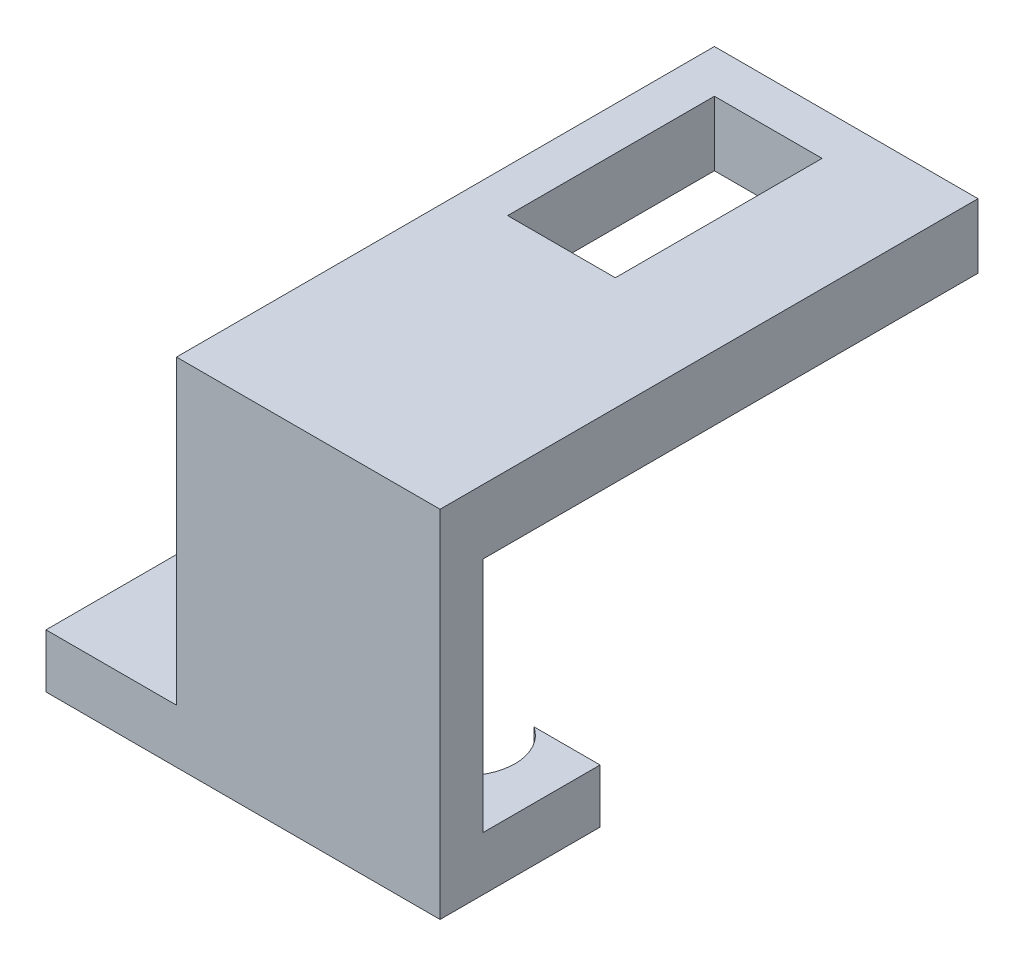
ISO-10303-21;
HEADER;
FILE_DESCRIPTION(('STEP AP214'),'2;1');
FILE_NAME('part.step','',(''),(''),'','','');
FILE_SCHEMA(('AUTOMOTIVE_DESIGN { 1 0 10303 214 1 1 1 1 }'));
ENDSEC;
DATA;
#1=APPLICATION_CONTEXT('core data for automotive mechanical design processes');
#2=APPLICATION_PROTOCOL_DEFINITION('international standard','automotive_design',2000,#1);
#3=PRODUCT_CONTEXT('',#1,'mechanical');
#4=PRODUCT('Part','Part','',(#3));
#5=PRODUCT_RELATED_PRODUCT_CATEGORY('part','',(#4));
#6=PRODUCT_DEFINITION_FORMATION('','',#4);
#7=PRODUCT_DEFINITION_CONTEXT('part definition',#1,'design');
#8=PRODUCT_DEFINITION('design','',#6,#7);
#9=PRODUCT_DEFINITION_SHAPE('','',#8);
#10=(LENGTH_UNIT() NAMED_UNIT(*) SI_UNIT(.MILLI.,.METRE.));
#11=(NAMED_UNIT(*) PLANE_ANGLE_UNIT() SI_UNIT($,.RADIAN.));
#12=(NAMED_UNIT(*) SI_UNIT($,.STERADIAN.) SOLID_ANGLE_UNIT());
#13=UNCERTAINTY_MEASURE_WITH_UNIT(LENGTH_MEASURE(1.E-05),#10,'distance_accuracy_value','');
#14=(GEOMETRIC_REPRESENTATION_CONTEXT(3) GLOBAL_UNCERTAINTY_ASSIGNED_CONTEXT((#13)) GLOBAL_UNIT_ASSIGNED_CONTEXT((#10,
#11,#12)) REPRESENTATION_CONTEXT('',''));
#15=CARTESIAN_POINT('',(0.,0.,0.));
#16=DIRECTION('',(0.,0.,1.));
#17=DIRECTION('',(1.,0.,0.));
#18=AXIS2_PLACEMENT_3D('',#15,#16,#17);
#19=CARTESIAN_POINT('',(9.15,16.5,3.5));
#20=DIRECTION('',(0.,0.,1.));
#21=DIRECTION('',(1.,0.,0.));
#22=AXIS2_PLACEMENT_3D('',#19,#20,#21);
#23=PLANE('',#22);
#24=DIRECTION('',(-1.,0.,0.));
#25=VECTOR('',#24,1.);
#26=CARTESIAN_POINT('',(9.15,2.5,3.5));
#27=LINE('',#26,#25);
#28=CARTESIAN_POINT('',(9.15,2.5,3.5));
#29=VERTEX_POINT('',#28);
#30=CARTESIAN_POINT('',(-3.09,2.5,3.5));
#31=VERTEX_POINT('',#30);
#32=EDGE_CURVE('E309',#29,#31,#27,.T.);
#33=ORIENTED_EDGE('',*,*,#32,.T.);
#34=DIRECTION('',(0.,-1.,0.));
#35=VECTOR('',#34,1.);
#36=CARTESIAN_POINT('',(-3.09,2.5,3.5));
#37=LINE('',#36,#35);
#38=CARTESIAN_POINT('',(-3.09,13.5,3.5));
#39=VERTEX_POINT('',#38);
#40=EDGE_CURVE('E389',#39,#31,#37,.T.);
#41=ORIENTED_EDGE('',*,*,#40,.F.);
#42=DIRECTION('',(-1.,0.,0.));
#43=VECTOR('',#42,1.);
#44=CARTESIAN_POINT('',(-9.15,13.5,3.5));
#45=LINE('',#44,#43);
#46=CARTESIAN_POINT('',(9.15,13.5,3.5));
#47=VERTEX_POINT('',#46);
#48=EDGE_CURVE('E392',#47,#39,#45,.T.);
#49=ORIENTED_EDGE('',*,*,#48,.F.);
#50=DIRECTION('',(0.,-1.,0.));
#51=VECTOR('',#50,1.);
#52=CARTESIAN_POINT('',(9.15,16.5,3.5));
#53=LINE('',#52,#51);
#54=EDGE_CURVE('E224',#47,#29,#53,.T.);
#55=ORIENTED_EDGE('',*,*,#54,.T.);
#56=EDGE_LOOP('',(#33,#41,#49,#55));
#57=FACE_BOUND('',#56,.T.);
#58=ADVANCED_FACE('F39',(#57),#23,.F.);
#59=CARTESIAN_POINT('',(-9.15,2.5,5.5));
#60=DIRECTION('',(0.,0.,-1.));
#61=DIRECTION('',(-1.,0.,0.));
#62=AXIS2_PLACEMENT_3D('',#59,#60,#61);
#63=PLANE('',#62);
#64=DIRECTION('',(1.,0.,0.));
#65=VECTOR('',#64,1.);
#66=CARTESIAN_POINT('',(9.15,16.5,5.5));
#67=LINE('',#66,#65);
#68=CARTESIAN_POINT('',(-3.09,16.5,5.5));
#69=VERTEX_POINT('',#68);
#70=CARTESIAN_POINT('',(9.15,16.5,5.5));
#71=VERTEX_POINT('',#70);
#72=EDGE_CURVE('E230',#69,#71,#67,.T.);
#73=ORIENTED_EDGE('',*,*,#72,.F.);
#74=DIRECTION('',(0.,1.,0.));
#75=VECTOR('',#74,1.);
#76=CARTESIAN_POINT('',(-3.09,2.5,5.5));
#77=LINE('',#76,#75);
#78=CARTESIAN_POINT('',(-3.09,2.5,5.5));
#79=VERTEX_POINT('',#78);
#80=EDGE_CURVE('E205',#79,#69,#77,.T.);
#81=ORIENTED_EDGE('',*,*,#80,.F.);
#82=DIRECTION('',(1.,0.,0.));
#83=VECTOR('',#82,1.);
#84=CARTESIAN_POINT('',(-9.15,2.5,5.5));
#85=LINE('',#84,#83);
#86=CARTESIAN_POINT('',(-9.15,2.5,5.5));
#87=VERTEX_POINT('',#86);
#88=EDGE_CURVE('E188',#87,#79,#85,.T.);
#89=ORIENTED_EDGE('',*,*,#88,.F.);
#90=DIRECTION('',(0.,-1.,0.));
#91=VECTOR('',#90,1.);
#92=CARTESIAN_POINT('',(-9.15,2.5,5.5));
#93=LINE('',#92,#91);
#94=CARTESIAN_POINT('',(-9.15,0.,5.5));
#95=VERTEX_POINT('',#94);
#96=EDGE_CURVE('E11',#87,#95,#93,.T.);
#97=ORIENTED_EDGE('',*,*,#96,.T.);
#98=DIRECTION('',(1.,0.,0.));
#99=VECTOR('',#98,1.);
#100=CARTESIAN_POINT('',(-9.15,0.,5.5));
#101=LINE('',#100,#99);
#102=CARTESIAN_POINT('',(9.15,0.,5.5));
#103=VERTEX_POINT('',#102);
#104=EDGE_CURVE('E217',#95,#103,#101,.T.);
#105=ORIENTED_EDGE('',*,*,#104,.T.);
#106=DIRECTION('',(0.,-1.,0.));
#107=VECTOR('',#106,1.);
#108=CARTESIAN_POINT('',(9.15,2.5,5.5));
#109=LINE('',#108,#107);
#110=EDGE_CURVE('E48',#71,#103,#109,.T.);
#111=ORIENTED_EDGE('',*,*,#110,.F.);
#112=EDGE_LOOP('',(#73,#81,#89,#97,#105,#111));
#113=FACE_BOUND('',#112,.T.);
#114=ADVANCED_FACE('F41',(#113),#63,.F.);
#115=CARTESIAN_POINT('',(9.15,2.5,3.5));
#116=DIRECTION('',(-1.,0.,0.));
#117=DIRECTION('',(0.,0.,1.));
#118=AXIS2_PLACEMENT_3D('',#115,#116,#117);
#119=PLANE('',#118);
#120=DIRECTION('',(0.,0.,-1.));
#121=VECTOR('',#120,1.);
#122=CARTESIAN_POINT('',(9.15,0.,3.5));
#123=LINE('',#122,#121);
#124=CARTESIAN_POINT('',(9.15,0.,-1.93067345763078));
#125=VERTEX_POINT('',#124);
#126=EDGE_CURVE('E220',#103,#125,#123,.T.);
#127=ORIENTED_EDGE('',*,*,#126,.T.);
#128=DIRECTION('',(0.,-1.,0.));
#129=VECTOR('',#128,1.);
#130=CARTESIAN_POINT('',(9.15,2.5,-1.93067345763078));
#131=LINE('',#130,#129);
#132=CARTESIAN_POINT('',(9.15,2.5,-1.93067345763078));
#133=VERTEX_POINT('',#132);
#134=EDGE_CURVE('E294',#133,#125,#131,.T.);
#135=ORIENTED_EDGE('',*,*,#134,.F.);
#136=DIRECTION('',(0.,0.,-1.));
#137=VECTOR('',#136,1.);
#138=CARTESIAN_POINT('',(9.15,2.5,5.5));
#139=LINE('',#138,#137);
#140=EDGE_CURVE('E197',#29,#133,#139,.T.);
#141=ORIENTED_EDGE('',*,*,#140,.F.);
#142=ORIENTED_EDGE('',*,*,#54,.F.);
#143=DIRECTION('',(0.,0.,1.));
#144=VECTOR('',#143,1.);
#145=CARTESIAN_POINT('',(9.15,13.5,-19.48));
#146=LINE('',#145,#144);
#147=CARTESIAN_POINT('',(9.15,13.5,-19.48));
#148=VERTEX_POINT('',#147);
#149=EDGE_CURVE('E315',#148,#47,#146,.T.);
#150=ORIENTED_EDGE('',*,*,#149,.F.);
#151=DIRECTION('',(0.,-1.,0.));
#152=VECTOR('',#151,1.);
#153=CARTESIAN_POINT('',(9.15,13.5,-19.48));
#154=LINE('',#153,#152);
#155=CARTESIAN_POINT('',(9.15,16.5,-19.48));
#156=VERTEX_POINT('',#155);
#157=EDGE_CURVE('E401',#156,#148,#154,.T.);
#158=ORIENTED_EDGE('',*,*,#157,.F.);
#159=DIRECTION('',(0.,0.,-1.));
#160=VECTOR('',#159,1.);
#161=CARTESIAN_POINT('',(9.15,16.5,5.5));
#162=LINE('',#161,#160);
#163=EDGE_CURVE('E304',#71,#156,#162,.T.);
#164=ORIENTED_EDGE('',*,*,#163,.F.);
#165=ORIENTED_EDGE('',*,*,#110,.T.);
#166=EDGE_LOOP('',(#127,#135,#141,#142,#150,#158,#164,#165));
#167=FACE_BOUND('',#166,.T.);
#168=ADVANCED_FACE('F300',(#167),#119,.F.);
#169=CARTESIAN_POINT('',(6.075,2.5,-1.93067345763078));
#170=DIRECTION('',(0.,0.,1.));
#171=DIRECTION('',(1.,0.,0.));
#172=AXIS2_PLACEMENT_3D('',#169,#170,#171);
#173=PLANE('',#172);
#174=DIRECTION('',(-1.,0.,0.));
#175=VECTOR('',#174,1.);
#176=CARTESIAN_POINT('',(6.075,0.,-1.93067345763078));
#177=LINE('',#176,#175);
#178=CARTESIAN_POINT('',(6.075,0.,-1.93067345763078));
#179=VERTEX_POINT('',#178);
#180=EDGE_CURVE('E228',#125,#179,#177,.T.);
#181=ORIENTED_EDGE('',*,*,#180,.T.);
#182=DIRECTION('',(0.,-1.,0.));
#183=VECTOR('',#182,1.);
#184=CARTESIAN_POINT('',(6.075,2.5,-1.93067345763078));
#185=LINE('',#184,#183);
#186=CARTESIAN_POINT('',(6.075,2.5,-1.93067345763078));
#187=VERTEX_POINT('',#186);
#188=EDGE_CURVE('E290',#187,#179,#185,.T.);
#189=ORIENTED_EDGE('',*,*,#188,.F.);
#190=DIRECTION('',(-1.,0.,0.));
#191=VECTOR('',#190,1.);
#192=CARTESIAN_POINT('',(6.075,2.5,-1.93067345763078));
#193=LINE('',#192,#191);
#194=EDGE_CURVE('E319',#133,#187,#193,.T.);
#195=ORIENTED_EDGE('',*,*,#194,.F.);
#196=ORIENTED_EDGE('',*,*,#134,.T.);
#197=EDGE_LOOP('',(#181,#189,#195,#196));
#198=FACE_BOUND('',#197,.T.);
#199=ADVANCED_FACE('F381',(#198),#173,.F.);
#200=CARTESIAN_POINT('',(4.825,2.5,0.));
#201=DIRECTION('',(0.,-1.,0.));
#202=DIRECTION('',(0.,0.,-1.));
#203=AXIS2_PLACEMENT_3D('',#200,#201,#202);
#204=CYLINDRICAL_SURFACE('',#203,2.3);
#205=CARTESIAN_POINT('',(4.825,0.,0.));
#206=DIRECTION('',(0.,-1.,0.));
#207=DIRECTION('',(0.,0.,1.));
#208=AXIS2_PLACEMENT_3D('',#205,#206,#207);
#209=CIRCLE('',#208,2.3);
#210=CARTESIAN_POINT('',(3.575,0.,-1.93067345763078));
#211=VERTEX_POINT('',#210);
#212=EDGE_CURVE('E237',#179,#211,#209,.T.);
#213=ORIENTED_EDGE('',*,*,#212,.T.);
#214=DIRECTION('',(0.,-1.,0.));
#215=VECTOR('',#214,1.);
#216=CARTESIAN_POINT('',(3.575,2.5,-1.93067345763078));
#217=LINE('',#216,#215);
#218=CARTESIAN_POINT('',(3.575,2.5,-1.93067345763078));
#219=VERTEX_POINT('',#218);
#220=EDGE_CURVE('E286',#219,#211,#217,.T.);
#221=ORIENTED_EDGE('',*,*,#220,.F.);
#222=CARTESIAN_POINT('',(4.825,2.5,0.));
#223=DIRECTION('',(0.,-1.,0.));
#224=DIRECTION('',(0.,0.,1.));
#225=AXIS2_PLACEMENT_3D('',#222,#223,#224);
#226=CIRCLE('',#225,2.3);
#227=EDGE_CURVE('E322',#187,#219,#226,.T.);
#228=ORIENTED_EDGE('',*,*,#227,.F.);
#229=ORIENTED_EDGE('',*,*,#188,.T.);
#230=EDGE_LOOP('',(#213,#221,#228,#229));
#231=FACE_BOUND('',#230,.T.);
#232=ADVANCED_FACE('F378',(#231),#204,.F.);
#233=CARTESIAN_POINT('',(0.575,2.5,-1.93067345763078));
#234=DIRECTION('',(0.,0.,1.));
#235=DIRECTION('',(1.,0.,0.));
#236=AXIS2_PLACEMENT_3D('',#233,#234,#235);
#237=PLANE('',#236);
#238=DIRECTION('',(-1.,0.,0.));
#239=VECTOR('',#238,1.);
#240=CARTESIAN_POINT('',(0.575,0.,-1.93067345763078));
#241=LINE('',#240,#239);
#242=CARTESIAN_POINT('',(0.575,0.,-1.93067345763078));
#243=VERTEX_POINT('',#242);
#244=EDGE_CURVE('E240',#211,#243,#241,.T.);
#245=ORIENTED_EDGE('',*,*,#244,.T.);
#246=DIRECTION('',(0.,-1.,0.));
#247=VECTOR('',#246,1.);
#248=CARTESIAN_POINT('',(0.575,2.5,-1.93067345763078));
#249=LINE('',#248,#247);
#250=CARTESIAN_POINT('',(0.575,2.5,-1.93067345763078));
#251=VERTEX_POINT('',#250);
#252=EDGE_CURVE('E282',#251,#243,#249,.T.);
#253=ORIENTED_EDGE('',*,*,#252,.F.);
#254=DIRECTION('',(-1.,0.,0.));
#255=VECTOR('',#254,1.);
#256=CARTESIAN_POINT('',(0.575,2.5,-1.93067345763078));
#257=LINE('',#256,#255);
#258=EDGE_CURVE('E325',#219,#251,#257,.T.);
#259=ORIENTED_EDGE('',*,*,#258,.F.);
#260=ORIENTED_EDGE('',*,*,#220,.T.);
#261=EDGE_LOOP('',(#245,#253,#259,#260));
#262=FACE_BOUND('',#261,.T.);
#263=ADVANCED_FACE('F374',(#262),#237,.F.);
#264=CARTESIAN_POINT('',(0.575,2.5,2.28112623762376));
#265=DIRECTION('',(1.,0.,0.));
#266=DIRECTION('',(0.,0.,-1.));
#267=AXIS2_PLACEMENT_3D('',#264,#265,#266);
#268=PLANE('',#267);
#269=DIRECTION('',(0.,0.,1.));
#270=VECTOR('',#269,1.);
#271=CARTESIAN_POINT('',(0.575,0.,2.28112623762376));
#272=LINE('',#271,#270);
#273=CARTESIAN_POINT('',(0.575,0.,2.28112623762376));
#274=VERTEX_POINT('',#273);
#275=EDGE_CURVE('E243',#243,#274,#272,.T.);
#276=ORIENTED_EDGE('',*,*,#275,.T.);
#277=DIRECTION('',(0.,-1.,0.));
#278=VECTOR('',#277,1.);
#279=CARTESIAN_POINT('',(0.575,2.5,2.28112623762376));
#280=LINE('',#279,#278);
#281=CARTESIAN_POINT('',(0.575,2.5,2.28112623762376));
#282=VERTEX_POINT('',#281);
#283=EDGE_CURVE('E278',#282,#274,#280,.T.);
#284=ORIENTED_EDGE('',*,*,#283,.F.);
#285=DIRECTION('',(0.,0.,1.));
#286=VECTOR('',#285,1.);
#287=CARTESIAN_POINT('',(0.575,2.5,2.28112623762376));
#288=LINE('',#287,#286);
#289=EDGE_CURVE('E328',#251,#282,#288,.T.);
#290=ORIENTED_EDGE('',*,*,#289,.F.);
#291=ORIENTED_EDGE('',*,*,#252,.T.);
#292=EDGE_LOOP('',(#276,#284,#290,#291));
#293=FACE_BOUND('',#292,.T.);
#294=ADVANCED_FACE('F369',(#293),#268,.F.);
#295=CARTESIAN_POINT('',(-0.575,2.5,2.28112623762376));
#296=DIRECTION('',(0.,0.,1.));
#297=DIRECTION('',(1.,0.,0.));
#298=AXIS2_PLACEMENT_3D('',#295,#296,#297);
#299=PLANE('',#298);
#300=DIRECTION('',(-1.,0.,0.));
#301=VECTOR('',#300,1.);
#302=CARTESIAN_POINT('',(-0.575,0.,2.28112623762376));
#303=LINE('',#302,#301);
#304=CARTESIAN_POINT('',(-0.575,0.,2.28112623762376));
#305=VERTEX_POINT('',#304);
#306=EDGE_CURVE('E246',#274,#305,#303,.T.);
#307=ORIENTED_EDGE('',*,*,#306,.T.);
#308=DIRECTION('',(0.,-1.,0.));
#309=VECTOR('',#308,1.);
#310=CARTESIAN_POINT('',(-0.575,2.5,2.28112623762376));
#311=LINE('',#310,#309);
#312=CARTESIAN_POINT('',(-0.575,2.5,2.28112623762376));
#313=VERTEX_POINT('',#312);
#314=EDGE_CURVE('E274',#313,#305,#311,.T.);
#315=ORIENTED_EDGE('',*,*,#314,.F.);
#316=DIRECTION('',(-1.,0.,0.));
#317=VECTOR('',#316,1.);
#318=CARTESIAN_POINT('',(-0.575,2.5,2.28112623762376));
#319=LINE('',#318,#317);
#320=EDGE_CURVE('E331',#282,#313,#319,.T.);
#321=ORIENTED_EDGE('',*,*,#320,.F.);
#322=ORIENTED_EDGE('',*,*,#283,.T.);
#323=EDGE_LOOP('',(#307,#315,#321,#322));
#324=FACE_BOUND('',#323,.T.);
#325=ADVANCED_FACE('F363',(#324),#299,.F.);
#326=CARTESIAN_POINT('',(-0.575,2.5,-1.93067345763078));
#327=DIRECTION('',(-1.,0.,0.));
#328=DIRECTION('',(0.,0.,1.));
#329=AXIS2_PLACEMENT_3D('',#326,#327,#328);
#330=PLANE('',#329);
#331=DIRECTION('',(0.,0.,-1.));
#332=VECTOR('',#331,1.);
#333=CARTESIAN_POINT('',(-0.575,0.,-1.93067345763078));
#334=LINE('',#333,#332);
#335=CARTESIAN_POINT('',(-0.575,0.,-1.93067345763078));
#336=VERTEX_POINT('',#335);
#337=EDGE_CURVE('E249',#305,#336,#334,.T.);
#338=ORIENTED_EDGE('',*,*,#337,.T.);
#339=DIRECTION('',(0.,-1.,0.));
#340=VECTOR('',#339,1.);
#341=CARTESIAN_POINT('',(-0.575,2.5,-1.93067345763078));
#342=LINE('',#341,#340);
#343=CARTESIAN_POINT('',(-0.575,2.5,-1.93067345763078));
#344=VERTEX_POINT('',#343);
#345=EDGE_CURVE('E270',#344,#336,#342,.T.);
#346=ORIENTED_EDGE('',*,*,#345,.F.);
#347=DIRECTION('',(0.,0.,-1.));
#348=VECTOR('',#347,1.);
#349=CARTESIAN_POINT('',(-0.575,2.5,-1.93067345763078));
#350=LINE('',#349,#348);
#351=EDGE_CURVE('E334',#313,#344,#350,.T.);
#352=ORIENTED_EDGE('',*,*,#351,.F.);
#353=ORIENTED_EDGE('',*,*,#314,.T.);
#354=EDGE_LOOP('',(#338,#346,#352,#353));
#355=FACE_BOUND('',#354,.T.);
#356=ADVANCED_FACE('F359',(#355),#330,.F.);
#357=CARTESIAN_POINT('',(-3.575,2.5,-1.93067345763078));
#358=DIRECTION('',(0.,0.,1.));
#359=DIRECTION('',(1.,0.,0.));
#360=AXIS2_PLACEMENT_3D('',#357,#358,#359);
#361=PLANE('',#360);
#362=DIRECTION('',(-1.,0.,0.));
#363=VECTOR('',#362,1.);
#364=CARTESIAN_POINT('',(-3.575,0.,-1.93067345763078));
#365=LINE('',#364,#363);
#366=CARTESIAN_POINT('',(-3.575,0.,-1.93067345763078));
#367=VERTEX_POINT('',#366);
#368=EDGE_CURVE('E252',#336,#367,#365,.T.);
#369=ORIENTED_EDGE('',*,*,#368,.T.);
#370=DIRECTION('',(0.,-1.,0.));
#371=VECTOR('',#370,1.);
#372=CARTESIAN_POINT('',(-3.575,2.5,-1.93067345763078));
#373=LINE('',#372,#371);
#374=CARTESIAN_POINT('',(-3.575,2.5,-1.93067345763078));
#375=VERTEX_POINT('',#374);
#376=EDGE_CURVE('E266',#375,#367,#373,.T.);
#377=ORIENTED_EDGE('',*,*,#376,.F.);
#378=DIRECTION('',(-1.,0.,0.));
#379=VECTOR('',#378,1.);
#380=CARTESIAN_POINT('',(-3.575,2.5,-1.93067345763078));
#381=LINE('',#380,#379);
#382=EDGE_CURVE('E337',#344,#375,#381,.T.);
#383=ORIENTED_EDGE('',*,*,#382,.F.);
#384=ORIENTED_EDGE('',*,*,#345,.T.);
#385=EDGE_LOOP('',(#369,#377,#383,#384));
#386=FACE_BOUND('',#385,.T.);
#387=ADVANCED_FACE('F355',(#386),#361,.F.);
#388=CARTESIAN_POINT('',(-4.825,2.5,0.));
#389=DIRECTION('',(0.,-1.,0.));
#390=DIRECTION('',(0.,0.,-1.));
#391=AXIS2_PLACEMENT_3D('',#388,#389,#390);
#392=CYLINDRICAL_SURFACE('',#391,2.3);
#393=CARTESIAN_POINT('',(-4.825,0.,0.));
#394=DIRECTION('',(0.,-1.,0.));
#395=DIRECTION('',(0.,0.,1.));
#396=AXIS2_PLACEMENT_3D('',#393,#394,#395);
#397=CIRCLE('',#396,2.3);
#398=CARTESIAN_POINT('',(-6.075,0.,-1.93067345763078));
#399=VERTEX_POINT('',#398);
#400=EDGE_CURVE('E255',#367,#399,#397,.T.);
#401=ORIENTED_EDGE('',*,*,#400,.T.);
#402=DIRECTION('',(0.,-1.,0.));
#403=VECTOR('',#402,1.);
#404=CARTESIAN_POINT('',(-6.075,2.5,-1.93067345763078));
#405=LINE('',#404,#403);
#406=CARTESIAN_POINT('',(-6.075,2.5,-1.93067345763078));
#407=VERTEX_POINT('',#406);
#408=EDGE_CURVE('E262',#407,#399,#405,.T.);
#409=ORIENTED_EDGE('',*,*,#408,.F.);
#410=CARTESIAN_POINT('',(-4.825,2.5,0.));
#411=DIRECTION('',(0.,-1.,0.));
#412=DIRECTION('',(0.,0.,1.));
#413=AXIS2_PLACEMENT_3D('',#410,#411,#412);
#414=CIRCLE('',#413,2.3);
#415=EDGE_CURVE('E339',#375,#407,#414,.T.);
#416=ORIENTED_EDGE('',*,*,#415,.F.);
#417=ORIENTED_EDGE('',*,*,#376,.T.);
#418=EDGE_LOOP('',(#401,#409,#416,#417));
#419=FACE_BOUND('',#418,.T.);
#420=ADVANCED_FACE('F347',(#419),#392,.F.);
#421=CARTESIAN_POINT('',(-6.075,2.5,-1.93067345763078));
#422=DIRECTION('',(0.,0.,1.));
#423=DIRECTION('',(1.,0.,0.));
#424=AXIS2_PLACEMENT_3D('',#421,#422,#423);
#425=PLANE('',#424);
#426=DIRECTION('',(-1.,0.,0.));
#427=VECTOR('',#426,1.);
#428=CARTESIAN_POINT('',(-6.075,0.,-1.93067345763078));
#429=LINE('',#428,#427);
#430=CARTESIAN_POINT('',(-9.15,0.,-1.93067345763078));
#431=VERTEX_POINT('',#430);
#432=EDGE_CURVE('E215',#399,#431,#429,.T.);
#433=ORIENTED_EDGE('',*,*,#432,.T.);
#434=DIRECTION('',(0.,-1.,0.));
#435=VECTOR('',#434,1.);
#436=CARTESIAN_POINT('',(-9.15,2.5,-1.93067345763078));
#437=LINE('',#436,#435);
#438=CARTESIAN_POINT('',(-9.15,2.5,-1.93067345763078));
#439=VERTEX_POINT('',#438);
#440=EDGE_CURVE('E211',#439,#431,#437,.T.);
#441=ORIENTED_EDGE('',*,*,#440,.F.);
#442=DIRECTION('',(-1.,0.,0.));
#443=VECTOR('',#442,1.);
#444=CARTESIAN_POINT('',(-6.075,2.5,-1.93067345763078));
#445=LINE('',#444,#443);
#446=EDGE_CURVE('E191',#407,#439,#445,.T.);
#447=ORIENTED_EDGE('',*,*,#446,.F.);
#448=ORIENTED_EDGE('',*,*,#408,.T.);
#449=EDGE_LOOP('',(#433,#441,#447,#448));
#450=FACE_BOUND('',#449,.T.);
#451=ADVANCED_FACE('F350',(#450),#425,.F.);
#452=CARTESIAN_POINT('',(-9.15,2.5,3.5));
#453=DIRECTION('',(1.,0.,0.));
#454=DIRECTION('',(0.,0.,-1.));
#455=AXIS2_PLACEMENT_3D('',#452,#453,#454);
#456=PLANE('',#455);
#457=ORIENTED_EDGE('',*,*,#96,.F.);
#458=DIRECTION('',(0.,0.,1.));
#459=VECTOR('',#458,1.);
#460=CARTESIAN_POINT('',(-9.15,2.5,3.5));
#461=LINE('',#460,#459);
#462=EDGE_CURVE('E183',#439,#87,#461,.T.);
#463=ORIENTED_EDGE('',*,*,#462,.F.);
#464=ORIENTED_EDGE('',*,*,#440,.T.);
#465=DIRECTION('',(0.,0.,1.));
#466=VECTOR('',#465,1.);
#467=CARTESIAN_POINT('',(-9.15,0.,3.5));
#468=LINE('',#467,#466);
#469=EDGE_CURVE('E198',#431,#95,#468,.T.);
#470=ORIENTED_EDGE('',*,*,#469,.T.);
#471=EDGE_LOOP('',(#457,#463,#464,#470));
#472=FACE_BOUND('',#471,.T.);
#473=ADVANCED_FACE('F208',(#472),#456,.F.);
#474=CARTESIAN_POINT('',(4.825,2.5,0.));
#475=DIRECTION('',(0.,1.,0.));
#476=DIRECTION('',(0.,0.,1.));
#477=AXIS2_PLACEMENT_3D('',#474,#475,#476);
#478=PLANE('',#477);
#479=ORIENTED_EDGE('',*,*,#32,.F.);
#480=ORIENTED_EDGE('',*,*,#140,.T.);
#481=ORIENTED_EDGE('',*,*,#194,.T.);
#482=ORIENTED_EDGE('',*,*,#227,.T.);
#483=ORIENTED_EDGE('',*,*,#258,.T.);
#484=ORIENTED_EDGE('',*,*,#289,.T.);
#485=ORIENTED_EDGE('',*,*,#320,.T.);
#486=ORIENTED_EDGE('',*,*,#351,.T.);
#487=ORIENTED_EDGE('',*,*,#382,.T.);
#488=ORIENTED_EDGE('',*,*,#415,.T.);
#489=ORIENTED_EDGE('',*,*,#446,.T.);
#490=ORIENTED_EDGE('',*,*,#462,.T.);
#491=ORIENTED_EDGE('',*,*,#88,.T.);
#492=DIRECTION('',(0.,0.,1.));
#493=VECTOR('',#492,1.);
#494=CARTESIAN_POINT('',(-3.09,2.5,-11.7552810528027));
#495=LINE('',#494,#493);
#496=EDGE_CURVE('E386',#31,#79,#495,.T.);
#497=ORIENTED_EDGE('',*,*,#496,.F.);
#498=EDGE_LOOP('',(#479,#480,#481,#482,#483,#484,#485,#486,#487,#488,#489,#490,#491,#497));
#499=FACE_BOUND('',#498,.T.);
#500=ADVANCED_FACE('F186',(#499),#478,.T.);
#501=CARTESIAN_POINT('',(4.825,0.,0.));
#502=DIRECTION('',(0.,1.,0.));
#503=DIRECTION('',(0.,0.,1.));
#504=AXIS2_PLACEMENT_3D('',#501,#502,#503);
#505=PLANE('',#504);
#506=ORIENTED_EDGE('',*,*,#104,.F.);
#507=ORIENTED_EDGE('',*,*,#469,.F.);
#508=ORIENTED_EDGE('',*,*,#432,.F.);
#509=ORIENTED_EDGE('',*,*,#400,.F.);
#510=ORIENTED_EDGE('',*,*,#368,.F.);
#511=ORIENTED_EDGE('',*,*,#337,.F.);
#512=ORIENTED_EDGE('',*,*,#306,.F.);
#513=ORIENTED_EDGE('',*,*,#275,.F.);
#514=ORIENTED_EDGE('',*,*,#244,.F.);
#515=ORIENTED_EDGE('',*,*,#212,.F.);
#516=ORIENTED_EDGE('',*,*,#180,.F.);
#517=ORIENTED_EDGE('',*,*,#126,.F.);
#518=EDGE_LOOP('',(#506,#507,#508,#509,#510,#511,#512,#513,#514,#515,#516,#517));
#519=FACE_BOUND('',#518,.T.);
#520=ADVANCED_FACE('F218',(#519),#505,.F.);
#521=CARTESIAN_POINT('',(0.,16.5,0.));
#522=DIRECTION('',(0.,1.,0.));
#523=DIRECTION('',(0.,0.,1.));
#524=AXIS2_PLACEMENT_3D('',#521,#522,#523);
#525=PLANE('',#524);
#526=DIRECTION('',(0.,0.,-1.));
#527=VECTOR('',#526,1.);
#528=CARTESIAN_POINT('',(-3.09000000000001,16.5,3.5));
#529=LINE('',#528,#527);
#530=CARTESIAN_POINT('',(-3.09000000000001,16.5,-19.48));
#531=VERTEX_POINT('',#530);
#532=EDGE_CURVE('E422',#69,#531,#529,.T.);
#533=ORIENTED_EDGE('',*,*,#532,.F.);
#534=ORIENTED_EDGE('',*,*,#72,.T.);
#535=ORIENTED_EDGE('',*,*,#163,.T.);
#536=DIRECTION('',(1.,0.,0.));
#537=VECTOR('',#536,1.);
#538=CARTESIAN_POINT('',(-9.15000000000001,16.5,-19.48));
#539=LINE('',#538,#537);
#540=EDGE_CURVE('E396',#531,#156,#539,.T.);
#541=ORIENTED_EDGE('',*,*,#540,.F.);
#542=EDGE_LOOP('',(#533,#534,#535,#541));
#543=FACE_BOUND('',#542,.T.);
#544=DIRECTION('',(0.,0.,1.));
#545=VECTOR('',#544,1.);
#546=CARTESIAN_POINT('',(-1.09000000000001,16.5,-7.87772752999999));
#547=LINE('',#546,#545);
#548=CARTESIAN_POINT('',(-1.09000000000001,16.5,-17.48));
#549=VERTEX_POINT('',#548);
#550=CARTESIAN_POINT('',(-1.09000000000001,16.5,-7.87772752999999));
#551=VERTEX_POINT('',#550);
#552=EDGE_CURVE('E55',#549,#551,#547,.T.);
#553=ORIENTED_EDGE('',*,*,#552,.F.);
#554=DIRECTION('',(-1.,0.,0.));
#555=VECTOR('',#554,1.);
#556=CARTESIAN_POINT('',(-1.09000000000001,16.5,-17.48));
#557=LINE('',#556,#555);
#558=CARTESIAN_POINT('',(3.90999999999999,16.5,-17.48));
#559=VERTEX_POINT('',#558);
#560=EDGE_CURVE('E428',#559,#549,#557,.T.);
#561=ORIENTED_EDGE('',*,*,#560,.F.);
#562=DIRECTION('',(0.,0.,-1.));
#563=VECTOR('',#562,1.);
#564=CARTESIAN_POINT('',(3.90999999999999,16.5,-7.87772752999999));
#565=LINE('',#564,#563);
#566=CARTESIAN_POINT('',(3.90999999999999,16.5,-7.87772752999999));
#567=VERTEX_POINT('',#566);
#568=EDGE_CURVE('E441',#567,#559,#565,.T.);
#569=ORIENTED_EDGE('',*,*,#568,.F.);
#570=DIRECTION('',(1.,0.,0.));
#571=VECTOR('',#570,1.);
#572=CARTESIAN_POINT('',(-1.09000000000001,16.5,-7.87772752999999));
#573=LINE('',#572,#571);
#574=EDGE_CURVE('E445',#551,#567,#573,.T.);
#575=ORIENTED_EDGE('',*,*,#574,.F.);
#576=EDGE_LOOP('',(#553,#561,#569,#575));
#577=FACE_BOUND('',#576,.T.);
#578=ADVANCED_FACE('F467',(#543,#577),#525,.T.);
#579=CARTESIAN_POINT('',(-9.15000000000001,13.5,-19.48));
#580=DIRECTION('',(0.,1.,0.));
#581=DIRECTION('',(-1.,0.,0.));
#582=AXIS2_PLACEMENT_3D('',#579,#580,#581);
#583=PLANE('',#582);
#584=DIRECTION('',(1.,0.,0.));
#585=VECTOR('',#584,1.);
#586=CARTESIAN_POINT('',(-1.09,13.5,-17.48));
#587=LINE('',#586,#585);
#588=CARTESIAN_POINT('',(-1.09000000000001,13.5,-17.48));
#589=VERTEX_POINT('',#588);
#590=CARTESIAN_POINT('',(3.90999999999999,13.5,-17.48));
#591=VERTEX_POINT('',#590);
#592=EDGE_CURVE('E452',#589,#591,#587,.T.);
#593=ORIENTED_EDGE('',*,*,#592,.F.);
#594=DIRECTION('',(0.,0.,-1.));
#595=VECTOR('',#594,1.);
#596=CARTESIAN_POINT('',(-1.09000000000001,13.5,-7.87772752999999));
#597=LINE('',#596,#595);
#598=CARTESIAN_POINT('',(-1.09000000000001,13.5,-7.87772752999999));
#599=VERTEX_POINT('',#598);
#600=EDGE_CURVE('E403',#599,#589,#597,.T.);
#601=ORIENTED_EDGE('',*,*,#600,.F.);
#602=DIRECTION('',(-1.,0.,0.));
#603=VECTOR('',#602,1.);
#604=CARTESIAN_POINT('',(-1.09,13.5,-7.87772752999999));
#605=LINE('',#604,#603);
#606=CARTESIAN_POINT('',(3.91,13.5,-7.87772752999999));
#607=VERTEX_POINT('',#606);
#608=EDGE_CURVE('E397',#607,#599,#605,.T.);
#609=ORIENTED_EDGE('',*,*,#608,.F.);
#610=DIRECTION('',(0.,0.,1.));
#611=VECTOR('',#610,1.);
#612=CARTESIAN_POINT('',(3.90999999999999,13.5,-7.87772752999999));
#613=LINE('',#612,#611);
#614=EDGE_CURVE('E437',#591,#607,#613,.T.);
#615=ORIENTED_EDGE('',*,*,#614,.F.);
#616=EDGE_LOOP('',(#593,#601,#609,#615));
#617=FACE_BOUND('',#616,.T.);
#618=ORIENTED_EDGE('',*,*,#48,.T.);
#619=DIRECTION('',(0.,0.,1.));
#620=VECTOR('',#619,1.);
#621=CARTESIAN_POINT('',(-3.09000000000001,13.5,3.5));
#622=LINE('',#621,#620);
#623=CARTESIAN_POINT('',(-3.09000000000001,13.5,-19.48));
#624=VERTEX_POINT('',#623);
#625=EDGE_CURVE('E416',#624,#39,#622,.T.);
#626=ORIENTED_EDGE('',*,*,#625,.F.);
#627=DIRECTION('',(-1.,0.,0.));
#628=VECTOR('',#627,1.);
#629=CARTESIAN_POINT('',(-9.15000000000001,13.5,-19.48));
#630=LINE('',#629,#628);
#631=EDGE_CURVE('E406',#148,#624,#630,.T.);
#632=ORIENTED_EDGE('',*,*,#631,.F.);
#633=ORIENTED_EDGE('',*,*,#149,.T.);
#634=EDGE_LOOP('',(#618,#626,#632,#633));
#635=FACE_BOUND('',#634,.T.);
#636=ADVANCED_FACE('F464',(#617,#635),#583,.F.);
#637=CARTESIAN_POINT('',(0.,0.,-19.48));
#638=DIRECTION('',(0.,0.,-1.));
#639=DIRECTION('',(-1.,0.,0.));
#640=AXIS2_PLACEMENT_3D('',#637,#638,#639);
#641=PLANE('',#640);
#642=DIRECTION('',(0.,1.,0.));
#643=VECTOR('',#642,1.);
#644=CARTESIAN_POINT('',(-3.09000000000001,-10.2656053994002,-19.48));
#645=LINE('',#644,#643);
#646=EDGE_CURVE('E419',#624,#531,#645,.T.);
#647=ORIENTED_EDGE('',*,*,#646,.T.);
#648=ORIENTED_EDGE('',*,*,#540,.T.);
#649=ORIENTED_EDGE('',*,*,#157,.T.);
#650=ORIENTED_EDGE('',*,*,#631,.T.);
#651=EDGE_LOOP('',(#647,#648,#649,#650));
#652=FACE_BOUND('',#651,.T.);
#653=ADVANCED_FACE('F466',(#652),#641,.T.);
#654=CARTESIAN_POINT('',(-3.09000000000001,-10.2656053994002,3.5));
#655=DIRECTION('',(1.,0.,0.));
#656=DIRECTION('',(0.,0.,-1.));
#657=AXIS2_PLACEMENT_3D('',#654,#655,#656);
#658=PLANE('',#657);
#659=ORIENTED_EDGE('',*,*,#625,.T.);
#660=ORIENTED_EDGE('',*,*,#40,.T.);
#661=ORIENTED_EDGE('',*,*,#496,.T.);
#662=ORIENTED_EDGE('',*,*,#80,.T.);
#663=ORIENTED_EDGE('',*,*,#532,.T.);
#664=ORIENTED_EDGE('',*,*,#646,.F.);
#665=EDGE_LOOP('',(#659,#660,#661,#662,#663,#664));
#666=FACE_BOUND('',#665,.T.);
#667=ADVANCED_FACE('F463',(#666),#658,.F.);
#668=CARTESIAN_POINT('',(-1.09000000000001,-10.2656053994002,-7.87772752999999));
#669=DIRECTION('',(-1.,0.,0.));
#670=DIRECTION('',(0.,0.,1.));
#671=AXIS2_PLACEMENT_3D('',#668,#669,#670);
#672=PLANE('',#671);
#673=ORIENTED_EDGE('',*,*,#600,.T.);
#674=DIRECTION('',(0.,1.,0.));
#675=VECTOR('',#674,1.);
#676=CARTESIAN_POINT('',(-1.09000000000001,-10.2656053994002,-17.48));
#677=LINE('',#676,#675);
#678=EDGE_CURVE('E434',#589,#549,#677,.T.);
#679=ORIENTED_EDGE('',*,*,#678,.T.);
#680=ORIENTED_EDGE('',*,*,#552,.T.);
#681=DIRECTION('',(0.,1.,0.));
#682=VECTOR('',#681,1.);
#683=CARTESIAN_POINT('',(-1.09000000000001,-10.2656053994002,-7.87772752999999));
#684=LINE('',#683,#682);
#685=EDGE_CURVE('E425',#599,#551,#684,.T.);
#686=ORIENTED_EDGE('',*,*,#685,.F.);
#687=EDGE_LOOP('',(#673,#679,#680,#686));
#688=FACE_BOUND('',#687,.T.);
#689=ADVANCED_FACE('F578',(#688),#672,.F.);
#690=CARTESIAN_POINT('',(-1.09000000000001,-10.2656053994002,-17.48));
#691=DIRECTION('',(0.,0.,-1.));
#692=DIRECTION('',(-1.,0.,0.));
#693=AXIS2_PLACEMENT_3D('',#690,#691,#692);
#694=PLANE('',#693);
#695=ORIENTED_EDGE('',*,*,#592,.T.);
#696=DIRECTION('',(0.,1.,0.));
#697=VECTOR('',#696,1.);
#698=CARTESIAN_POINT('',(3.90999999999999,-10.2656053994002,-17.48));
#699=LINE('',#698,#697);
#700=EDGE_CURVE('E431',#591,#559,#699,.T.);
#701=ORIENTED_EDGE('',*,*,#700,.T.);
#702=ORIENTED_EDGE('',*,*,#560,.T.);
#703=ORIENTED_EDGE('',*,*,#678,.F.);
#704=EDGE_LOOP('',(#695,#701,#702,#703));
#705=FACE_BOUND('',#704,.T.);
#706=ADVANCED_FACE('F589',(#705),#694,.F.);
#707=CARTESIAN_POINT('',(3.90999999999999,-10.2656053994002,-7.87772752999999));
#708=DIRECTION('',(1.,0.,0.));
#709=DIRECTION('',(0.,0.,-1.));
#710=AXIS2_PLACEMENT_3D('',#707,#708,#709);
#711=PLANE('',#710);
#712=ORIENTED_EDGE('',*,*,#614,.T.);
#713=DIRECTION('',(0.,1.,0.));
#714=VECTOR('',#713,1.);
#715=CARTESIAN_POINT('',(3.90999999999999,-10.2656053994002,-7.87772752999999));
#716=LINE('',#715,#714);
#717=EDGE_CURVE('E63',#607,#567,#716,.T.);
#718=ORIENTED_EDGE('',*,*,#717,.T.);
#719=ORIENTED_EDGE('',*,*,#568,.T.);
#720=ORIENTED_EDGE('',*,*,#700,.F.);
#721=EDGE_LOOP('',(#712,#718,#719,#720));
#722=FACE_BOUND('',#721,.T.);
#723=ADVANCED_FACE('F596',(#722),#711,.F.);
#724=CARTESIAN_POINT('',(-1.09000000000001,-10.2656053994002,-7.87772752999999));
#725=DIRECTION('',(0.,0.,1.));
#726=DIRECTION('',(1.,0.,0.));
#727=AXIS2_PLACEMENT_3D('',#724,#725,#726);
#728=PLANE('',#727);
#729=ORIENTED_EDGE('',*,*,#608,.T.);
#730=ORIENTED_EDGE('',*,*,#685,.T.);
#731=ORIENTED_EDGE('',*,*,#574,.T.);
#732=ORIENTED_EDGE('',*,*,#717,.F.);
#733=EDGE_LOOP('',(#729,#730,#731,#732));
#734=FACE_BOUND('',#733,.T.);
#735=ADVANCED_FACE('F604',(#734),#728,.F.);
#736=CLOSED_SHELL('',(#58,#114,#168,#199,#232,#263,#294,#325,#356,#387,#420,#451,#473,#500,#520,
#578,#636,#653,#667,#689,#706,#723,#735));
#737=MANIFOLD_SOLID_BREP('B2',#736);
#738=ADVANCED_BREP_SHAPE_REPRESENTATION('',(#18,#737),#14);
#739=SHAPE_DEFINITION_REPRESENTATION(#9,#738);
ENDSEC;
END-ISO-10303-21;
